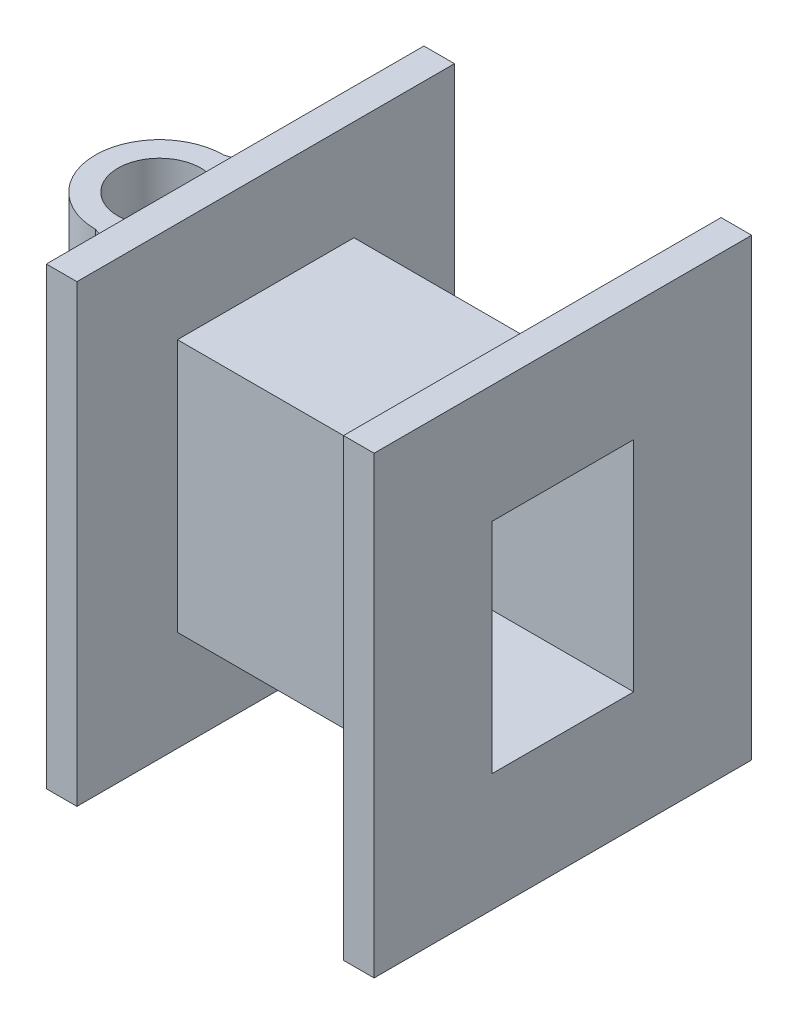
ISO-10303-21;
HEADER;
FILE_DESCRIPTION(('STEP AP214'),'2;1');
FILE_NAME('part.step','',(''),(''),'','','');
FILE_SCHEMA(('AUTOMOTIVE_DESIGN { 1 0 10303 214 1 1 1 1 }'));
ENDSEC;
DATA;
#1=APPLICATION_CONTEXT('core data for automotive mechanical design processes');
#2=APPLICATION_PROTOCOL_DEFINITION('international standard','automotive_design',2000,#1);
#3=PRODUCT_CONTEXT('',#1,'mechanical');
#4=PRODUCT('Part','Part','',(#3));
#5=PRODUCT_RELATED_PRODUCT_CATEGORY('part','',(#4));
#6=PRODUCT_DEFINITION_FORMATION('','',#4);
#7=PRODUCT_DEFINITION_CONTEXT('part definition',#1,'design');
#8=PRODUCT_DEFINITION('design','',#6,#7);
#9=PRODUCT_DEFINITION_SHAPE('','',#8);
#10=(LENGTH_UNIT() NAMED_UNIT(*) SI_UNIT(.MILLI.,.METRE.));
#11=(NAMED_UNIT(*) PLANE_ANGLE_UNIT() SI_UNIT($,.RADIAN.));
#12=(NAMED_UNIT(*) SI_UNIT($,.STERADIAN.) SOLID_ANGLE_UNIT());
#13=UNCERTAINTY_MEASURE_WITH_UNIT(LENGTH_MEASURE(1.E-05),#10,'distance_accuracy_value','');
#14=(GEOMETRIC_REPRESENTATION_CONTEXT(3) GLOBAL_UNCERTAINTY_ASSIGNED_CONTEXT((#13)) GLOBAL_UNIT_ASSIGNED_CONTEXT((#10,
#11,#12)) REPRESENTATION_CONTEXT('',''));
#15=CARTESIAN_POINT('',(0.,0.,0.));
#16=DIRECTION('',(0.,0.,1.));
#17=DIRECTION('',(1.,0.,0.));
#18=AXIS2_PLACEMENT_3D('',#15,#16,#17);
#19=CARTESIAN_POINT('',(18.75,14.5,10.1));
#20=DIRECTION('',(0.,-1.,0.));
#21=DIRECTION('',(0.,0.,-1.));
#22=AXIS2_PLACEMENT_3D('',#19,#20,#21);
#23=PLANE('',#22);
#24=DIRECTION('',(0.,0.,-1.));
#25=VECTOR('',#24,1.);
#26=CARTESIAN_POINT('',(-15.25,14.5,10.1));
#27=LINE('',#26,#25);
#28=CARTESIAN_POINT('',(-15.25,14.5,10.1));
#29=VERTEX_POINT('',#28);
#30=CARTESIAN_POINT('',(-15.25,14.5,-10.1));
#31=VERTEX_POINT('',#30);
#32=EDGE_CURVE('E63',#29,#31,#27,.T.);
#33=ORIENTED_EDGE('',*,*,#32,.F.);
#34=DIRECTION('',(-1.,0.,0.));
#35=VECTOR('',#34,1.);
#36=CARTESIAN_POINT('',(18.75,14.5,10.1));
#37=LINE('',#36,#35);
#38=CARTESIAN_POINT('',(15.25,14.5,10.1));
#39=VERTEX_POINT('',#38);
#40=EDGE_CURVE('E49',#39,#29,#37,.T.);
#41=ORIENTED_EDGE('',*,*,#40,.F.);
#42=DIRECTION('',(0.,0.,1.));
#43=VECTOR('',#42,1.);
#44=CARTESIAN_POINT('',(15.25,14.5,10.1));
#45=LINE('',#44,#43);
#46=CARTESIAN_POINT('',(15.25,14.5,-10.1));
#47=VERTEX_POINT('',#46);
#48=EDGE_CURVE('E312',#47,#39,#45,.T.);
#49=ORIENTED_EDGE('',*,*,#48,.F.);
#50=DIRECTION('',(-1.,0.,0.));
#51=VECTOR('',#50,1.);
#52=CARTESIAN_POINT('',(18.75,14.5,-10.1));
#53=LINE('',#52,#51);
#54=EDGE_CURVE('E403',#47,#31,#53,.T.);
#55=ORIENTED_EDGE('',*,*,#54,.T.);
#56=EDGE_LOOP('',(#33,#41,#49,#55));
#57=FACE_BOUND('',#56,.T.);
#58=ADVANCED_FACE('F46',(#57),#23,.F.);
#59=CARTESIAN_POINT('',(18.75,14.5,10.1));
#60=DIRECTION('',(0.,0.,-1.));
#61=DIRECTION('',(0.,1.,0.));
#62=AXIS2_PLACEMENT_3D('',#59,#60,#61);
#63=PLANE('',#62);
#64=DIRECTION('',(0.,1.,0.));
#65=VECTOR('',#64,1.);
#66=CARTESIAN_POINT('',(-15.25,14.5,10.1));
#67=LINE('',#66,#65);
#68=CARTESIAN_POINT('',(-15.25,-14.5,10.1));
#69=VERTEX_POINT('',#68);
#70=EDGE_CURVE('E70',#69,#29,#67,.T.);
#71=ORIENTED_EDGE('',*,*,#70,.F.);
#72=DIRECTION('',(-1.,0.,0.));
#73=VECTOR('',#72,1.);
#74=CARTESIAN_POINT('',(18.75,-14.5,10.1));
#75=LINE('',#74,#73);
#76=CARTESIAN_POINT('',(15.25,-14.5,10.1));
#77=VERTEX_POINT('',#76);
#78=EDGE_CURVE('E408',#77,#69,#75,.T.);
#79=ORIENTED_EDGE('',*,*,#78,.F.);
#80=DIRECTION('',(0.,-1.,0.));
#81=VECTOR('',#80,1.);
#82=CARTESIAN_POINT('',(15.25,14.5,10.1));
#83=LINE('',#82,#81);
#84=EDGE_CURVE('E308',#39,#77,#83,.T.);
#85=ORIENTED_EDGE('',*,*,#84,.F.);
#86=ORIENTED_EDGE('',*,*,#40,.T.);
#87=EDGE_LOOP('',(#71,#79,#85,#86));
#88=FACE_BOUND('',#87,.T.);
#89=ADVANCED_FACE('F417',(#88),#63,.F.);
#90=CARTESIAN_POINT('',(18.75,-14.5,10.1));
#91=DIRECTION('',(0.,1.,0.));
#92=DIRECTION('',(0.,0.,1.));
#93=AXIS2_PLACEMENT_3D('',#90,#91,#92);
#94=PLANE('',#93);
#95=DIRECTION('',(0.,0.,1.));
#96=VECTOR('',#95,1.);
#97=CARTESIAN_POINT('',(-15.25,-14.5,10.1));
#98=LINE('',#97,#96);
#99=CARTESIAN_POINT('',(-15.25,-14.5,-10.1));
#100=VERTEX_POINT('',#99);
#101=EDGE_CURVE('E248',#100,#69,#98,.T.);
#102=ORIENTED_EDGE('',*,*,#101,.F.);
#103=DIRECTION('',(-1.,0.,0.));
#104=VECTOR('',#103,1.);
#105=CARTESIAN_POINT('',(18.75,-14.5,-10.1));
#106=LINE('',#105,#104);
#107=CARTESIAN_POINT('',(15.25,-14.5,-10.1));
#108=VERTEX_POINT('',#107);
#109=EDGE_CURVE('E406',#108,#100,#106,.T.);
#110=ORIENTED_EDGE('',*,*,#109,.F.);
#111=DIRECTION('',(0.,0.,-1.));
#112=VECTOR('',#111,1.);
#113=CARTESIAN_POINT('',(15.25,-14.5,10.1));
#114=LINE('',#113,#112);
#115=EDGE_CURVE('E304',#77,#108,#114,.T.);
#116=ORIENTED_EDGE('',*,*,#115,.F.);
#117=ORIENTED_EDGE('',*,*,#78,.T.);
#118=EDGE_LOOP('',(#102,#110,#116,#117));
#119=FACE_BOUND('',#118,.T.);
#120=ADVANCED_FACE('F420',(#119),#94,.F.);
#121=CARTESIAN_POINT('',(18.75,14.5,-10.1));
#122=DIRECTION('',(0.,0.,1.));
#123=DIRECTION('',(0.,-1.,0.));
#124=AXIS2_PLACEMENT_3D('',#121,#122,#123);
#125=PLANE('',#124);
#126=DIRECTION('',(0.,-1.,0.));
#127=VECTOR('',#126,1.);
#128=CARTESIAN_POINT('',(-15.25,14.5,-10.1));
#129=LINE('',#128,#127);
#130=EDGE_CURVE('E238',#31,#100,#129,.T.);
#131=ORIENTED_EDGE('',*,*,#130,.F.);
#132=ORIENTED_EDGE('',*,*,#54,.F.);
#133=DIRECTION('',(0.,1.,0.));
#134=VECTOR('',#133,1.);
#135=CARTESIAN_POINT('',(15.25,14.5,-10.1));
#136=LINE('',#135,#134);
#137=EDGE_CURVE('E292',#108,#47,#136,.T.);
#138=ORIENTED_EDGE('',*,*,#137,.F.);
#139=ORIENTED_EDGE('',*,*,#109,.T.);
#140=EDGE_LOOP('',(#131,#132,#138,#139));
#141=FACE_BOUND('',#140,.T.);
#142=ADVANCED_FACE('F424',(#141),#125,.F.);
#143=CARTESIAN_POINT('',(18.75,0.,0.));
#144=DIRECTION('',(-1.,0.,0.));
#145=DIRECTION('',(0.,0.,1.));
#146=AXIS2_PLACEMENT_3D('',#143,#144,#145);
#147=PLANE('',#146);
#148=DIRECTION('',(0.,1.,0.));
#149=VECTOR('',#148,1.);
#150=CARTESIAN_POINT('',(18.75,12.5,-8.1));
#151=LINE('',#150,#149);
#152=CARTESIAN_POINT('',(18.75,-12.5,-8.1));
#153=VERTEX_POINT('',#152);
#154=CARTESIAN_POINT('',(18.75,12.5,-8.1));
#155=VERTEX_POINT('',#154);
#156=EDGE_CURVE('E360',#153,#155,#151,.T.);
#157=ORIENTED_EDGE('',*,*,#156,.F.);
#158=DIRECTION('',(0.,0.,-1.));
#159=VECTOR('',#158,1.);
#160=CARTESIAN_POINT('',(18.75,-12.5,8.1));
#161=LINE('',#160,#159);
#162=CARTESIAN_POINT('',(18.75,-12.5,8.1));
#163=VERTEX_POINT('',#162);
#164=EDGE_CURVE('E371',#163,#153,#161,.T.);
#165=ORIENTED_EDGE('',*,*,#164,.F.);
#166=DIRECTION('',(0.,-1.,0.));
#167=VECTOR('',#166,1.);
#168=CARTESIAN_POINT('',(18.75,12.5,8.1));
#169=LINE('',#168,#167);
#170=CARTESIAN_POINT('',(18.75,12.5,8.1));
#171=VERTEX_POINT('',#170);
#172=EDGE_CURVE('E367',#171,#163,#169,.T.);
#173=ORIENTED_EDGE('',*,*,#172,.F.);
#174=DIRECTION('',(0.,0.,1.));
#175=VECTOR('',#174,1.);
#176=CARTESIAN_POINT('',(18.75,12.5,8.1));
#177=LINE('',#176,#175);
#178=EDGE_CURVE('E363',#155,#171,#177,.T.);
#179=ORIENTED_EDGE('',*,*,#178,.F.);
#180=EDGE_LOOP('',(#157,#165,#173,#179));
#181=FACE_BOUND('',#180,.T.);
#182=DIRECTION('',(0.,1.,0.));
#183=VECTOR('',#182,1.);
#184=CARTESIAN_POINT('',(18.75,26.,-21.6));
#185=LINE('',#184,#183);
#186=CARTESIAN_POINT('',(18.75,-26.,-21.6));
#187=VERTEX_POINT('',#186);
#188=CARTESIAN_POINT('',(18.75,26.,-21.6));
#189=VERTEX_POINT('',#188);
#190=EDGE_CURVE('E256',#187,#189,#185,.T.);
#191=ORIENTED_EDGE('',*,*,#190,.T.);
#192=DIRECTION('',(0.,0.,1.));
#193=VECTOR('',#192,1.);
#194=CARTESIAN_POINT('',(18.75,26.,21.6));
#195=LINE('',#194,#193);
#196=CARTESIAN_POINT('',(18.75,26.,21.6));
#197=VERTEX_POINT('',#196);
#198=EDGE_CURVE('E278',#189,#197,#195,.T.);
#199=ORIENTED_EDGE('',*,*,#198,.T.);
#200=DIRECTION('',(0.,-1.,0.));
#201=VECTOR('',#200,1.);
#202=CARTESIAN_POINT('',(18.75,26.,21.6));
#203=LINE('',#202,#201);
#204=CARTESIAN_POINT('',(18.75,-26.,21.6));
#205=VERTEX_POINT('',#204);
#206=EDGE_CURVE('E282',#197,#205,#203,.T.);
#207=ORIENTED_EDGE('',*,*,#206,.T.);
#208=DIRECTION('',(0.,0.,-1.));
#209=VECTOR('',#208,1.);
#210=CARTESIAN_POINT('',(18.75,-26.,21.6));
#211=LINE('',#210,#209);
#212=EDGE_CURVE('E262',#205,#187,#211,.T.);
#213=ORIENTED_EDGE('',*,*,#212,.T.);
#214=EDGE_LOOP('',(#191,#199,#207,#213));
#215=FACE_BOUND('',#214,.T.);
#216=ADVANCED_FACE('F426',(#181,#215),#147,.F.);
#217=CARTESIAN_POINT('',(-18.75,0.,0.));
#218=DIRECTION('',(-1.,0.,0.));
#219=DIRECTION('',(0.,0.,1.));
#220=AXIS2_PLACEMENT_3D('',#217,#218,#219);
#221=PLANE('',#220);
#222=DIRECTION('',(0.,0.,1.));
#223=VECTOR('',#222,1.);
#224=CARTESIAN_POINT('',(-18.75,12.5,0.));
#225=LINE('',#224,#223);
#226=CARTESIAN_POINT('',(-18.75,12.5,-10.1));
#227=VERTEX_POINT('',#226);
#228=CARTESIAN_POINT('',(-18.75,12.5,-8.1));
#229=VERTEX_POINT('',#228);
#230=EDGE_CURVE('E56',#227,#229,#225,.T.);
#231=ORIENTED_EDGE('',*,*,#230,.F.);
#232=DIRECTION('',(0.,1.,0.));
#233=VECTOR('',#232,1.);
#234=CARTESIAN_POINT('',(-18.75,14.5,-10.1));
#235=LINE('',#234,#233);
#236=CARTESIAN_POINT('',(-18.75,18.,-10.1));
#237=VERTEX_POINT('',#236);
#238=EDGE_CURVE('E400',#227,#237,#235,.T.);
#239=ORIENTED_EDGE('',*,*,#238,.T.);
#240=DIRECTION('',(0.,0.,1.));
#241=VECTOR('',#240,1.);
#242=CARTESIAN_POINT('',(-18.75,18.,0.));
#243=LINE('',#242,#241);
#244=CARTESIAN_POINT('',(-18.75,18.,10.1));
#245=VERTEX_POINT('',#244);
#246=EDGE_CURVE('E349',#237,#245,#243,.T.);
#247=ORIENTED_EDGE('',*,*,#246,.T.);
#248=DIRECTION('',(0.,-1.,0.));
#249=VECTOR('',#248,1.);
#250=CARTESIAN_POINT('',(-18.75,14.5,10.1));
#251=LINE('',#250,#249);
#252=CARTESIAN_POINT('',(-18.75,12.5,10.1));
#253=VERTEX_POINT('',#252);
#254=EDGE_CURVE('E396',#245,#253,#251,.T.);
#255=ORIENTED_EDGE('',*,*,#254,.T.);
#256=CARTESIAN_POINT('',(-18.75,12.5,8.1));
#257=VERTEX_POINT('',#256);
#258=EDGE_CURVE('E11',#257,#253,#225,.T.);
#259=ORIENTED_EDGE('',*,*,#258,.F.);
#260=DIRECTION('',(0.,-1.,0.));
#261=VECTOR('',#260,1.);
#262=CARTESIAN_POINT('',(-18.75,12.5,8.1));
#263=LINE('',#262,#261);
#264=CARTESIAN_POINT('',(-18.75,-12.5,8.1));
#265=VERTEX_POINT('',#264);
#266=EDGE_CURVE('E378',#257,#265,#263,.T.);
#267=ORIENTED_EDGE('',*,*,#266,.T.);
#268=DIRECTION('',(0.,0.,-1.));
#269=VECTOR('',#268,1.);
#270=CARTESIAN_POINT('',(-18.75,-12.5,8.1));
#271=LINE('',#270,#269);
#272=CARTESIAN_POINT('',(-18.75,-12.5,-8.1));
#273=VERTEX_POINT('',#272);
#274=EDGE_CURVE('E364',#265,#273,#271,.T.);
#275=ORIENTED_EDGE('',*,*,#274,.T.);
#276=DIRECTION('',(0.,1.,0.));
#277=VECTOR('',#276,1.);
#278=CARTESIAN_POINT('',(-18.75,12.5,-8.1));
#279=LINE('',#278,#277);
#280=EDGE_CURVE('E359',#273,#229,#279,.T.);
#281=ORIENTED_EDGE('',*,*,#280,.T.);
#282=EDGE_LOOP('',(#231,#239,#247,#255,#259,#267,#275,#281));
#283=FACE_BOUND('',#282,.T.);
#284=DIRECTION('',(0.,1.,0.));
#285=VECTOR('',#284,1.);
#286=CARTESIAN_POINT('',(-18.75,26.,-21.6));
#287=LINE('',#286,#285);
#288=CARTESIAN_POINT('',(-18.75,-26.,-21.6));
#289=VERTEX_POINT('',#288);
#290=CARTESIAN_POINT('',(-18.75,26.,-21.6));
#291=VERTEX_POINT('',#290);
#292=EDGE_CURVE('E229',#289,#291,#287,.T.);
#293=ORIENTED_EDGE('',*,*,#292,.F.);
#294=DIRECTION('',(0.,0.,-1.));
#295=VECTOR('',#294,1.);
#296=CARTESIAN_POINT('',(-18.75,-26.,21.6));
#297=LINE('',#296,#295);
#298=CARTESIAN_POINT('',(-18.75,-26.,21.6));
#299=VERTEX_POINT('',#298);
#300=EDGE_CURVE('E205',#299,#289,#297,.T.);
#301=ORIENTED_EDGE('',*,*,#300,.F.);
#302=DIRECTION('',(0.,-1.,0.));
#303=VECTOR('',#302,1.);
#304=CARTESIAN_POINT('',(-18.75,26.,21.6));
#305=LINE('',#304,#303);
#306=CARTESIAN_POINT('',(-18.75,26.,21.6));
#307=VERTEX_POINT('',#306);
#308=EDGE_CURVE('E222',#307,#299,#305,.T.);
#309=ORIENTED_EDGE('',*,*,#308,.F.);
#310=DIRECTION('',(0.,0.,1.));
#311=VECTOR('',#310,1.);
#312=CARTESIAN_POINT('',(-18.75,26.,21.6));
#313=LINE('',#312,#311);
#314=EDGE_CURVE('E217',#291,#307,#313,.T.);
#315=ORIENTED_EDGE('',*,*,#314,.F.);
#316=EDGE_LOOP('',(#293,#301,#309,#315));
#317=FACE_BOUND('',#316,.T.);
#318=ADVANCED_FACE('F432',(#283,#317),#221,.T.);
#319=CARTESIAN_POINT('',(18.75,12.5,-8.1));
#320=DIRECTION('',(0.,0.,1.));
#321=DIRECTION('',(0.,-1.,0.));
#322=AXIS2_PLACEMENT_3D('',#319,#320,#321);
#323=PLANE('',#322);
#324=ORIENTED_EDGE('',*,*,#280,.F.);
#325=DIRECTION('',(-1.,0.,0.));
#326=VECTOR('',#325,1.);
#327=CARTESIAN_POINT('',(18.75,-12.5,-8.1));
#328=LINE('',#327,#326);
#329=EDGE_CURVE('E374',#153,#273,#328,.T.);
#330=ORIENTED_EDGE('',*,*,#329,.F.);
#331=ORIENTED_EDGE('',*,*,#156,.T.);
#332=DIRECTION('',(-1.,0.,0.));
#333=VECTOR('',#332,1.);
#334=CARTESIAN_POINT('',(18.75,12.5,-8.1));
#335=LINE('',#334,#333);
#336=EDGE_CURVE('E393',#155,#229,#335,.T.);
#337=ORIENTED_EDGE('',*,*,#336,.T.);
#338=EDGE_LOOP('',(#324,#330,#331,#337));
#339=FACE_BOUND('',#338,.T.);
#340=ADVANCED_FACE('F463',(#339),#323,.T.);
#341=CARTESIAN_POINT('',(18.75,12.5,8.1));
#342=DIRECTION('',(0.,-1.,0.));
#343=DIRECTION('',(0.,0.,-1.));
#344=AXIS2_PLACEMENT_3D('',#341,#342,#343);
#345=PLANE('',#344);
#346=ORIENTED_EDGE('',*,*,#230,.T.);
#347=ORIENTED_EDGE('',*,*,#336,.F.);
#348=ORIENTED_EDGE('',*,*,#178,.T.);
#349=DIRECTION('',(-1.,0.,0.));
#350=VECTOR('',#349,1.);
#351=CARTESIAN_POINT('',(18.75,12.5,8.1));
#352=LINE('',#351,#350);
#353=EDGE_CURVE('E390',#171,#257,#352,.T.);
#354=ORIENTED_EDGE('',*,*,#353,.T.);
#355=ORIENTED_EDGE('',*,*,#258,.T.);
#356=DIRECTION('',(-0.952932129606418,0.,-0.303183700689496));
#357=VECTOR('',#356,1.);
#358=CARTESIAN_POINT('',(-4.6415329263768,12.5,14.5887323299758));
#359=LINE('',#358,#357);
#360=CARTESIAN_POINT('',(-27.4030406453615,12.5,7.34695935463854));
#361=VERTEX_POINT('',#360);
#362=EDGE_CURVE('E328',#253,#361,#359,.T.);
#363=ORIENTED_EDGE('',*,*,#362,.T.);
#364=CARTESIAN_POINT('',(-27.4030406453615,12.5,0.));
#365=DIRECTION('',(0.,1.,0.));
#366=DIRECTION('',(0.,0.,1.));
#367=AXIS2_PLACEMENT_3D('',#364,#365,#366);
#368=CIRCLE('',#367,7.34695935463854);
#369=CARTESIAN_POINT('',(-27.4030406453615,12.5,-7.34695935463854));
#370=VERTEX_POINT('',#369);
#371=EDGE_CURVE('E324',#370,#361,#368,.T.);
#372=ORIENTED_EDGE('',*,*,#371,.F.);
#373=DIRECTION('',(-0.952932129606418,0.,0.303183700689496));
#374=VECTOR('',#373,1.);
#375=CARTESIAN_POINT('',(-4.64153292637679,12.5,-14.5887323299758));
#376=LINE('',#375,#374);
#377=EDGE_CURVE('E320',#227,#370,#376,.T.);
#378=ORIENTED_EDGE('',*,*,#377,.F.);
#379=EDGE_LOOP('',(#346,#347,#348,#354,#355,#363,#372,#378));
#380=FACE_BOUND('',#379,.T.);
#381=CARTESIAN_POINT('',(-27.4030406453615,12.5,0.));
#382=DIRECTION('',(0.,1.,0.));
#383=DIRECTION('',(0.,0.,1.));
#384=AXIS2_PLACEMENT_3D('',#381,#382,#383);
#385=CIRCLE('',#384,4.75);
#386=CARTESIAN_POINT('',(-27.4030406453615,12.5,4.75000000000005));
#387=VERTEX_POINT('',#386);
#388=EDGE_CURVE('E316',#387,#387,#385,.T.);
#389=ORIENTED_EDGE('',*,*,#388,.T.);
#390=EDGE_LOOP('',(#389));
#391=FACE_BOUND('',#390,.T.);
#392=ADVANCED_FACE('F471',(#380,#391),#345,.T.);
#393=CARTESIAN_POINT('',(18.75,12.5,8.1));
#394=DIRECTION('',(0.,0.,-1.));
#395=DIRECTION('',(0.,1.,0.));
#396=AXIS2_PLACEMENT_3D('',#393,#394,#395);
#397=PLANE('',#396);
#398=ORIENTED_EDGE('',*,*,#266,.F.);
#399=ORIENTED_EDGE('',*,*,#353,.F.);
#400=ORIENTED_EDGE('',*,*,#172,.T.);
#401=DIRECTION('',(-1.,0.,0.));
#402=VECTOR('',#401,1.);
#403=CARTESIAN_POINT('',(18.75,-12.5,8.1));
#404=LINE('',#403,#402);
#405=EDGE_CURVE('E387',#163,#265,#404,.T.);
#406=ORIENTED_EDGE('',*,*,#405,.T.);
#407=EDGE_LOOP('',(#398,#399,#400,#406));
#408=FACE_BOUND('',#407,.T.);
#409=ADVANCED_FACE('F480',(#408),#397,.T.);
#410=CARTESIAN_POINT('',(18.75,-12.5,8.1));
#411=DIRECTION('',(0.,1.,0.));
#412=DIRECTION('',(0.,0.,1.));
#413=AXIS2_PLACEMENT_3D('',#410,#411,#412);
#414=PLANE('',#413);
#415=ORIENTED_EDGE('',*,*,#274,.F.);
#416=ORIENTED_EDGE('',*,*,#405,.F.);
#417=ORIENTED_EDGE('',*,*,#164,.T.);
#418=ORIENTED_EDGE('',*,*,#329,.T.);
#419=EDGE_LOOP('',(#415,#416,#417,#418));
#420=FACE_BOUND('',#419,.T.);
#421=ADVANCED_FACE('F489',(#420),#414,.T.);
#422=CARTESIAN_POINT('',(-4.64153292637679,18.,-14.5887323299758));
#423=DIRECTION('',(0.303183700689496,0.,0.952932129606418));
#424=DIRECTION('',(0.952932129606418,0.,-0.303183700689496));
#425=AXIS2_PLACEMENT_3D('',#422,#423,#424);
#426=PLANE('',#425);
#427=DIRECTION('',(-0.952932129606418,0.,0.303183700689496));
#428=VECTOR('',#427,1.);
#429=CARTESIAN_POINT('',(-4.64153292637679,18.,-14.5887323299758));
#430=LINE('',#429,#428);
#431=CARTESIAN_POINT('',(-27.4030406453615,18.,-7.34695935463854));
#432=VERTEX_POINT('',#431);
#433=EDGE_CURVE('E338',#237,#432,#430,.T.);
#434=ORIENTED_EDGE('',*,*,#433,.F.);
#435=ORIENTED_EDGE('',*,*,#238,.F.);
#436=ORIENTED_EDGE('',*,*,#377,.T.);
#437=DIRECTION('',(0.,-1.,0.));
#438=VECTOR('',#437,1.);
#439=CARTESIAN_POINT('',(-27.4030406453615,18.,-7.34695935463854));
#440=LINE('',#439,#438);
#441=EDGE_CURVE('E356',#432,#370,#440,.T.);
#442=ORIENTED_EDGE('',*,*,#441,.F.);
#443=EDGE_LOOP('',(#434,#435,#436,#442));
#444=FACE_BOUND('',#443,.T.);
#445=ADVANCED_FACE('F498',(#444),#426,.F.);
#446=CARTESIAN_POINT('',(-27.4030406453615,18.,0.));
#447=DIRECTION('',(0.,-1.,0.));
#448=DIRECTION('',(0.,0.,-1.));
#449=AXIS2_PLACEMENT_3D('',#446,#447,#448);
#450=CYLINDRICAL_SURFACE('',#449,7.34695935463854);
#451=ORIENTED_EDGE('',*,*,#441,.T.);
#452=ORIENTED_EDGE('',*,*,#371,.T.);
#453=DIRECTION('',(0.,-1.,0.));
#454=VECTOR('',#453,1.);
#455=CARTESIAN_POINT('',(-27.4030406453615,18.,7.34695935463854));
#456=LINE('',#455,#454);
#457=CARTESIAN_POINT('',(-27.4030406453615,18.,7.34695935463854));
#458=VERTEX_POINT('',#457);
#459=EDGE_CURVE('E353',#458,#361,#456,.T.);
#460=ORIENTED_EDGE('',*,*,#459,.F.);
#461=CARTESIAN_POINT('',(-27.4030406453615,18.,0.));
#462=DIRECTION('',(0.,1.,0.));
#463=DIRECTION('',(0.,0.,1.));
#464=AXIS2_PLACEMENT_3D('',#461,#462,#463);
#465=CIRCLE('',#464,7.34695935463854);
#466=EDGE_CURVE('E342',#432,#458,#465,.T.);
#467=ORIENTED_EDGE('',*,*,#466,.F.);
#468=EDGE_LOOP('',(#451,#452,#460,#467));
#469=FACE_BOUND('',#468,.T.);
#470=ADVANCED_FACE('F507',(#469),#450,.T.);
#471=CARTESIAN_POINT('',(-4.6415329263768,18.,14.5887323299758));
#472=DIRECTION('',(-0.303183700689496,0.,0.952932129606417));
#473=DIRECTION('',(0.952932129606418,0.,0.303183700689496));
#474=AXIS2_PLACEMENT_3D('',#471,#472,#473);
#475=PLANE('',#474);
#476=ORIENTED_EDGE('',*,*,#459,.T.);
#477=ORIENTED_EDGE('',*,*,#362,.F.);
#478=ORIENTED_EDGE('',*,*,#254,.F.);
#479=DIRECTION('',(-0.952932129606418,0.,-0.303183700689496));
#480=VECTOR('',#479,1.);
#481=CARTESIAN_POINT('',(-4.6415329263768,18.,14.5887323299758));
#482=LINE('',#481,#480);
#483=EDGE_CURVE('E345',#245,#458,#482,.T.);
#484=ORIENTED_EDGE('',*,*,#483,.T.);
#485=EDGE_LOOP('',(#476,#477,#478,#484));
#486=FACE_BOUND('',#485,.T.);
#487=ADVANCED_FACE('F516',(#486),#475,.T.);
#488=CARTESIAN_POINT('',(-27.4030406453615,18.,0.));
#489=DIRECTION('',(0.,-1.,0.));
#490=DIRECTION('',(0.,0.,-1.));
#491=AXIS2_PLACEMENT_3D('',#488,#489,#490);
#492=CYLINDRICAL_SURFACE('',#491,4.75);
#493=CARTESIAN_POINT('',(-27.4030406453615,18.,0.));
#494=DIRECTION('',(0.,1.,0.));
#495=DIRECTION('',(0.,0.,1.));
#496=AXIS2_PLACEMENT_3D('',#493,#494,#495);
#497=CIRCLE('',#496,4.75);
#498=CARTESIAN_POINT('',(-27.4030406453615,18.,4.75000000000005));
#499=VERTEX_POINT('',#498);
#500=EDGE_CURVE('E334',#499,#499,#497,.T.);
#501=ORIENTED_EDGE('',*,*,#500,.T.);
#502=EDGE_LOOP('',(#501));
#503=FACE_BOUND('',#502,.T.);
#504=ORIENTED_EDGE('',*,*,#388,.F.);
#505=EDGE_LOOP('',(#504));
#506=FACE_BOUND('',#505,.T.);
#507=ADVANCED_FACE('F525',(#503,#506),#492,.F.);
#508=CARTESIAN_POINT('',(0.,18.,0.));
#509=DIRECTION('',(0.,1.,0.));
#510=DIRECTION('',(0.,0.,1.));
#511=AXIS2_PLACEMENT_3D('',#508,#509,#510);
#512=PLANE('',#511);
#513=ORIENTED_EDGE('',*,*,#500,.F.);
#514=EDGE_LOOP('',(#513));
#515=FACE_BOUND('',#514,.T.);
#516=ORIENTED_EDGE('',*,*,#433,.T.);
#517=ORIENTED_EDGE('',*,*,#466,.T.);
#518=ORIENTED_EDGE('',*,*,#483,.F.);
#519=ORIENTED_EDGE('',*,*,#246,.F.);
#520=EDGE_LOOP('',(#516,#517,#518,#519));
#521=FACE_BOUND('',#520,.T.);
#522=ADVANCED_FACE('F534',(#515,#521),#512,.T.);
#523=CARTESIAN_POINT('',(15.25,0.,0.));
#524=DIRECTION('',(1.,0.,0.));
#525=DIRECTION('',(0.,0.,-1.));
#526=AXIS2_PLACEMENT_3D('',#523,#524,#525);
#527=PLANE('',#526);
#528=DIRECTION('',(0.,1.,0.));
#529=VECTOR('',#528,1.);
#530=CARTESIAN_POINT('',(15.25,26.,-21.6));
#531=LINE('',#530,#529);
#532=CARTESIAN_POINT('',(15.25,-26.,-21.6));
#533=VERTEX_POINT('',#532);
#534=CARTESIAN_POINT('',(15.25,26.,-21.6));
#535=VERTEX_POINT('',#534);
#536=EDGE_CURVE('E257',#533,#535,#531,.T.);
#537=ORIENTED_EDGE('',*,*,#536,.F.);
#538=DIRECTION('',(0.,0.,-1.));
#539=VECTOR('',#538,1.);
#540=CARTESIAN_POINT('',(15.25,-26.,21.6));
#541=LINE('',#540,#539);
#542=CARTESIAN_POINT('',(15.25,-26.,21.6));
#543=VERTEX_POINT('',#542);
#544=EDGE_CURVE('E270',#543,#533,#541,.T.);
#545=ORIENTED_EDGE('',*,*,#544,.F.);
#546=DIRECTION('',(0.,-1.,0.));
#547=VECTOR('',#546,1.);
#548=CARTESIAN_POINT('',(15.25,26.,21.6));
#549=LINE('',#548,#547);
#550=CARTESIAN_POINT('',(15.25,26.,21.6));
#551=VERTEX_POINT('',#550);
#552=EDGE_CURVE('E266',#551,#543,#549,.T.);
#553=ORIENTED_EDGE('',*,*,#552,.F.);
#554=DIRECTION('',(0.,0.,1.));
#555=VECTOR('',#554,1.);
#556=CARTESIAN_POINT('',(15.25,26.,21.6));
#557=LINE('',#556,#555);
#558=EDGE_CURVE('E261',#535,#551,#557,.T.);
#559=ORIENTED_EDGE('',*,*,#558,.F.);
#560=EDGE_LOOP('',(#537,#545,#553,#559));
#561=FACE_BOUND('',#560,.T.);
#562=ORIENTED_EDGE('',*,*,#137,.T.);
#563=ORIENTED_EDGE('',*,*,#48,.T.);
#564=ORIENTED_EDGE('',*,*,#84,.T.);
#565=ORIENTED_EDGE('',*,*,#115,.T.);
#566=EDGE_LOOP('',(#562,#563,#564,#565));
#567=FACE_BOUND('',#566,.T.);
#568=ADVANCED_FACE('F423',(#561,#567),#527,.F.);
#569=CARTESIAN_POINT('',(15.25,26.,-21.6));
#570=DIRECTION('',(0.,0.,-1.));
#571=DIRECTION('',(-1.,0.,0.));
#572=AXIS2_PLACEMENT_3D('',#569,#570,#571);
#573=PLANE('',#572);
#574=ORIENTED_EDGE('',*,*,#190,.F.);
#575=DIRECTION('',(1.,0.,0.));
#576=VECTOR('',#575,1.);
#577=CARTESIAN_POINT('',(15.25,-26.,-21.6));
#578=LINE('',#577,#576);
#579=EDGE_CURVE('E289',#533,#187,#578,.T.);
#580=ORIENTED_EDGE('',*,*,#579,.F.);
#581=ORIENTED_EDGE('',*,*,#536,.T.);
#582=DIRECTION('',(1.,0.,0.));
#583=VECTOR('',#582,1.);
#584=CARTESIAN_POINT('',(15.25,26.,-21.6));
#585=LINE('',#584,#583);
#586=EDGE_CURVE('E274',#535,#189,#585,.T.);
#587=ORIENTED_EDGE('',*,*,#586,.T.);
#588=EDGE_LOOP('',(#574,#580,#581,#587));
#589=FACE_BOUND('',#588,.T.);
#590=ADVANCED_FACE('F551',(#589),#573,.T.);
#591=CARTESIAN_POINT('',(15.25,-26.,21.6));
#592=DIRECTION('',(0.,-1.,0.));
#593=DIRECTION('',(0.,0.,-1.));
#594=AXIS2_PLACEMENT_3D('',#591,#592,#593);
#595=PLANE('',#594);
#596=ORIENTED_EDGE('',*,*,#212,.F.);
#597=DIRECTION('',(1.,0.,0.));
#598=VECTOR('',#597,1.);
#599=CARTESIAN_POINT('',(15.25,-26.,21.6));
#600=LINE('',#599,#598);
#601=EDGE_CURVE('E293',#543,#205,#600,.T.);
#602=ORIENTED_EDGE('',*,*,#601,.F.);
#603=ORIENTED_EDGE('',*,*,#544,.T.);
#604=ORIENTED_EDGE('',*,*,#579,.T.);
#605=EDGE_LOOP('',(#596,#602,#603,#604));
#606=FACE_BOUND('',#605,.T.);
#607=ADVANCED_FACE('F560',(#606),#595,.T.);
#608=CARTESIAN_POINT('',(15.25,26.,21.6));
#609=DIRECTION('',(0.,0.,1.));
#610=DIRECTION('',(1.,0.,0.));
#611=AXIS2_PLACEMENT_3D('',#608,#609,#610);
#612=PLANE('',#611);
#613=ORIENTED_EDGE('',*,*,#206,.F.);
#614=DIRECTION('',(1.,0.,0.));
#615=VECTOR('',#614,1.);
#616=CARTESIAN_POINT('',(15.25,26.,21.6));
#617=LINE('',#616,#615);
#618=EDGE_CURVE('E296',#551,#197,#617,.T.);
#619=ORIENTED_EDGE('',*,*,#618,.F.);
#620=ORIENTED_EDGE('',*,*,#552,.T.);
#621=ORIENTED_EDGE('',*,*,#601,.T.);
#622=EDGE_LOOP('',(#613,#619,#620,#621));
#623=FACE_BOUND('',#622,.T.);
#624=ADVANCED_FACE('F569',(#623),#612,.T.);
#625=CARTESIAN_POINT('',(15.25,26.,21.6));
#626=DIRECTION('',(0.,1.,0.));
#627=DIRECTION('',(0.,0.,1.));
#628=AXIS2_PLACEMENT_3D('',#625,#626,#627);
#629=PLANE('',#628);
#630=ORIENTED_EDGE('',*,*,#198,.F.);
#631=ORIENTED_EDGE('',*,*,#586,.F.);
#632=ORIENTED_EDGE('',*,*,#558,.T.);
#633=ORIENTED_EDGE('',*,*,#618,.T.);
#634=EDGE_LOOP('',(#630,#631,#632,#633));
#635=FACE_BOUND('',#634,.T.);
#636=ADVANCED_FACE('F578',(#635),#629,.T.);
#637=CARTESIAN_POINT('',(-15.25,0.,0.));
#638=DIRECTION('',(-1.,0.,0.));
#639=DIRECTION('',(0.,0.,-1.));
#640=AXIS2_PLACEMENT_3D('',#637,#638,#639);
#641=PLANE('',#640);
#642=DIRECTION('',(0.,1.,0.));
#643=VECTOR('',#642,1.);
#644=CARTESIAN_POINT('',(-15.25,26.,-21.6));
#645=LINE('',#644,#643);
#646=CARTESIAN_POINT('',(-15.25,-26.,-21.6));
#647=VERTEX_POINT('',#646);
#648=CARTESIAN_POINT('',(-15.25,26.,-21.6));
#649=VERTEX_POINT('',#648);
#650=EDGE_CURVE('E192',#647,#649,#645,.T.);
#651=ORIENTED_EDGE('',*,*,#650,.T.);
#652=DIRECTION('',(0.,0.,1.));
#653=VECTOR('',#652,1.);
#654=CARTESIAN_POINT('',(-15.25,26.,21.6));
#655=LINE('',#654,#653);
#656=CARTESIAN_POINT('',(-15.25,26.,21.6));
#657=VERTEX_POINT('',#656);
#658=EDGE_CURVE('E211',#649,#657,#655,.T.);
#659=ORIENTED_EDGE('',*,*,#658,.T.);
#660=DIRECTION('',(0.,-1.,0.));
#661=VECTOR('',#660,1.);
#662=CARTESIAN_POINT('',(-15.25,26.,21.6));
#663=LINE('',#662,#661);
#664=CARTESIAN_POINT('',(-15.25,-26.,21.6));
#665=VERTEX_POINT('',#664);
#666=EDGE_CURVE('E195',#657,#665,#663,.T.);
#667=ORIENTED_EDGE('',*,*,#666,.T.);
#668=DIRECTION('',(0.,0.,-1.));
#669=VECTOR('',#668,1.);
#670=CARTESIAN_POINT('',(-15.25,-26.,21.6));
#671=LINE('',#670,#669);
#672=EDGE_CURVE('E187',#665,#647,#671,.T.);
#673=ORIENTED_EDGE('',*,*,#672,.T.);
#674=EDGE_LOOP('',(#651,#659,#667,#673));
#675=FACE_BOUND('',#674,.T.);
#676=ORIENTED_EDGE('',*,*,#70,.T.);
#677=ORIENTED_EDGE('',*,*,#32,.T.);
#678=ORIENTED_EDGE('',*,*,#130,.T.);
#679=ORIENTED_EDGE('',*,*,#101,.T.);
#680=EDGE_LOOP('',(#676,#677,#678,#679));
#681=FACE_BOUND('',#680,.T.);
#682=ADVANCED_FACE('F189',(#675,#681),#641,.F.);
#683=CARTESIAN_POINT('',(-15.25,26.,-21.6));
#684=DIRECTION('',(0.,0.,1.));
#685=DIRECTION('',(1.,0.,0.));
#686=AXIS2_PLACEMENT_3D('',#683,#684,#685);
#687=PLANE('',#686);
#688=ORIENTED_EDGE('',*,*,#292,.T.);
#689=DIRECTION('',(-1.,0.,0.));
#690=VECTOR('',#689,1.);
#691=CARTESIAN_POINT('',(-15.25,26.,-21.6));
#692=LINE('',#691,#690);
#693=EDGE_CURVE('E215',#649,#291,#692,.T.);
#694=ORIENTED_EDGE('',*,*,#693,.F.);
#695=ORIENTED_EDGE('',*,*,#650,.F.);
#696=DIRECTION('',(-1.,0.,0.));
#697=VECTOR('',#696,1.);
#698=CARTESIAN_POINT('',(-15.25,-26.,-21.6));
#699=LINE('',#698,#697);
#700=EDGE_CURVE('E202',#647,#289,#699,.T.);
#701=ORIENTED_EDGE('',*,*,#700,.T.);
#702=EDGE_LOOP('',(#688,#694,#695,#701));
#703=FACE_BOUND('',#702,.T.);
#704=ADVANCED_FACE('F213',(#703),#687,.F.);
#705=CARTESIAN_POINT('',(-15.25,26.,21.6));
#706=DIRECTION('',(0.,-1.,0.));
#707=DIRECTION('',(0.,0.,-1.));
#708=AXIS2_PLACEMENT_3D('',#705,#706,#707);
#709=PLANE('',#708);
#710=ORIENTED_EDGE('',*,*,#314,.T.);
#711=DIRECTION('',(-1.,0.,0.));
#712=VECTOR('',#711,1.);
#713=CARTESIAN_POINT('',(-15.25,26.,21.6));
#714=LINE('',#713,#712);
#715=EDGE_CURVE('E239',#657,#307,#714,.T.);
#716=ORIENTED_EDGE('',*,*,#715,.F.);
#717=ORIENTED_EDGE('',*,*,#658,.F.);
#718=ORIENTED_EDGE('',*,*,#693,.T.);
#719=EDGE_LOOP('',(#710,#716,#717,#718));
#720=FACE_BOUND('',#719,.T.);
#721=ADVANCED_FACE('F602',(#720),#709,.F.);
#722=CARTESIAN_POINT('',(-15.25,26.,21.6));
#723=DIRECTION('',(0.,0.,-1.));
#724=DIRECTION('',(-1.,0.,0.));
#725=AXIS2_PLACEMENT_3D('',#722,#723,#724);
#726=PLANE('',#725);
#727=ORIENTED_EDGE('',*,*,#308,.T.);
#728=DIRECTION('',(-1.,0.,0.));
#729=VECTOR('',#728,1.);
#730=CARTESIAN_POINT('',(-15.25,-26.,21.6));
#731=LINE('',#730,#729);
#732=EDGE_CURVE('E210',#665,#299,#731,.T.);
#733=ORIENTED_EDGE('',*,*,#732,.F.);
#734=ORIENTED_EDGE('',*,*,#666,.F.);
#735=ORIENTED_EDGE('',*,*,#715,.T.);
#736=EDGE_LOOP('',(#727,#733,#734,#735));
#737=FACE_BOUND('',#736,.T.);
#738=ADVANCED_FACE('F610',(#737),#726,.F.);
#739=CARTESIAN_POINT('',(-15.25,-26.,21.6));
#740=DIRECTION('',(0.,1.,0.));
#741=DIRECTION('',(0.,0.,1.));
#742=AXIS2_PLACEMENT_3D('',#739,#740,#741);
#743=PLANE('',#742);
#744=ORIENTED_EDGE('',*,*,#300,.T.);
#745=ORIENTED_EDGE('',*,*,#700,.F.);
#746=ORIENTED_EDGE('',*,*,#672,.F.);
#747=ORIENTED_EDGE('',*,*,#732,.T.);
#748=EDGE_LOOP('',(#744,#745,#746,#747));
#749=FACE_BOUND('',#748,.T.);
#750=ADVANCED_FACE('F203',(#749),#743,.F.);
#751=CLOSED_SHELL('',(#58,#89,#120,#142,#216,#318,#340,#392,#409,#421,#445,#470,#487,#507,#522,
#568,#590,#607,#624,#636,#682,#704,#721,#738,#750));
#752=MANIFOLD_SOLID_BREP('B2',#751);
#753=ADVANCED_BREP_SHAPE_REPRESENTATION('',(#18,#752),#14);
#754=SHAPE_DEFINITION_REPRESENTATION(#9,#753);
ENDSEC;
END-ISO-10303-21;
